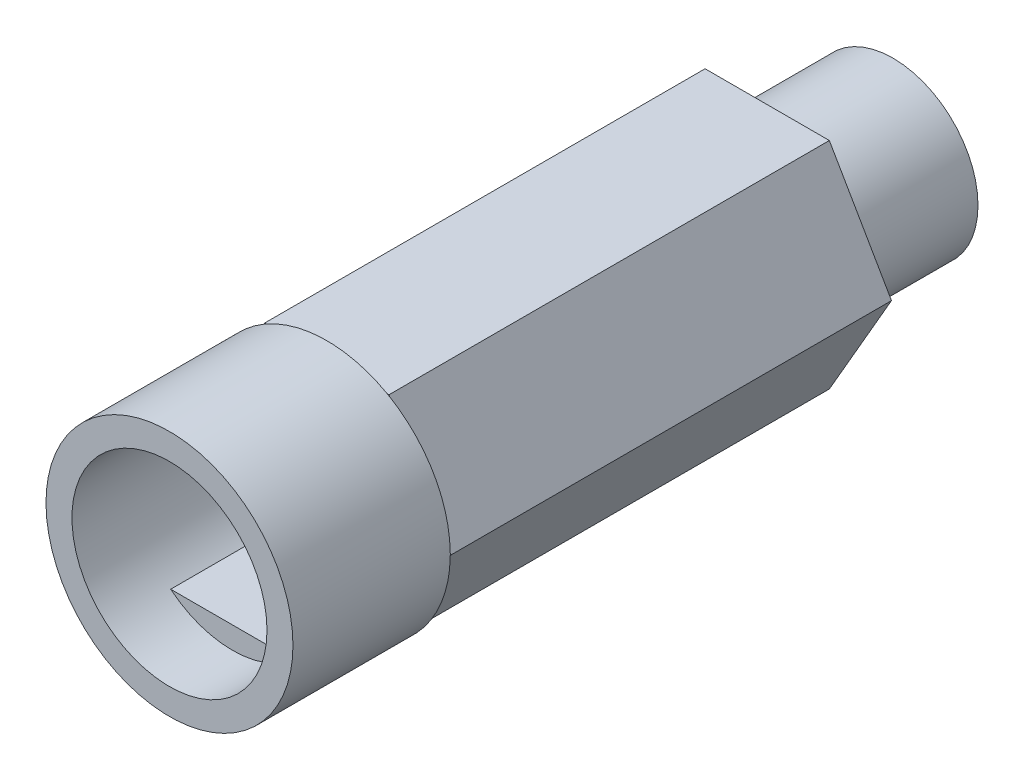
ISO-10303-21;
HEADER;
FILE_DESCRIPTION(('STEP AP214'),'2;1');
FILE_NAME('part.step','',(''),(''),'','','');
FILE_SCHEMA(('AUTOMOTIVE_DESIGN { 1 0 10303 214 1 1 1 1 }'));
ENDSEC;
DATA;
#1=APPLICATION_CONTEXT('core data for automotive mechanical design processes');
#2=APPLICATION_PROTOCOL_DEFINITION('international standard','automotive_design',2000,#1);
#3=PRODUCT_CONTEXT('',#1,'mechanical');
#4=PRODUCT('Part','Part','',(#3));
#5=PRODUCT_RELATED_PRODUCT_CATEGORY('part','',(#4));
#6=PRODUCT_DEFINITION_FORMATION('','',#4);
#7=PRODUCT_DEFINITION_CONTEXT('part definition',#1,'design');
#8=PRODUCT_DEFINITION('design','',#6,#7);
#9=PRODUCT_DEFINITION_SHAPE('','',#8);
#10=(LENGTH_UNIT() NAMED_UNIT(*) SI_UNIT(.MILLI.,.METRE.));
#11=(NAMED_UNIT(*) PLANE_ANGLE_UNIT() SI_UNIT($,.RADIAN.));
#12=(NAMED_UNIT(*) SI_UNIT($,.STERADIAN.) SOLID_ANGLE_UNIT());
#13=UNCERTAINTY_MEASURE_WITH_UNIT(LENGTH_MEASURE(1.E-05),#10,'distance_accuracy_value','');
#14=(GEOMETRIC_REPRESENTATION_CONTEXT(3) GLOBAL_UNCERTAINTY_ASSIGNED_CONTEXT((#13)) GLOBAL_UNIT_ASSIGNED_CONTEXT((#10,
#11,#12)) REPRESENTATION_CONTEXT('',''));
#15=CARTESIAN_POINT('',(0.,0.,0.));
#16=DIRECTION('',(0.,0.,1.));
#17=DIRECTION('',(1.,0.,0.));
#18=AXIS2_PLACEMENT_3D('',#15,#16,#17);
#19=CARTESIAN_POINT('',(0.,-2.4,3.));
#20=DIRECTION('',(0.,-1.,0.));
#21=DIRECTION('',(0.,0.,-1.));
#22=AXIS2_PLACEMENT_3D('',#19,#20,#21);
#23=PLANE('',#22);
#24=DIRECTION('',(-1.,0.,0.));
#25=VECTOR('',#24,1.);
#26=CARTESIAN_POINT('',(0.,-2.4,17.));
#27=LINE('',#26,#25);
#28=CARTESIAN_POINT('',(1.96214168703486,-2.4,17.));
#29=VERTEX_POINT('',#28);
#30=CARTESIAN_POINT('',(-1.96214168703486,-2.4,17.));
#31=VERTEX_POINT('',#30);
#32=EDGE_CURVE('E140',#29,#31,#27,.T.);
#33=ORIENTED_EDGE('',*,*,#32,.F.);
#34=DIRECTION('',(0.,0.,1.));
#35=VECTOR('',#34,1.);
#36=CARTESIAN_POINT('',(1.96214168703486,-2.4,3.));
#37=LINE('',#36,#35);
#38=CARTESIAN_POINT('',(1.96214168703486,-2.4,3.));
#39=VERTEX_POINT('',#38);
#40=EDGE_CURVE('E153',#39,#29,#37,.T.);
#41=ORIENTED_EDGE('',*,*,#40,.F.);
#42=DIRECTION('',(1.,0.,0.));
#43=VECTOR('',#42,1.);
#44=CARTESIAN_POINT('',(0.,-2.4,3.));
#45=LINE('',#44,#43);
#46=CARTESIAN_POINT('',(-1.96214168703486,-2.4,3.));
#47=VERTEX_POINT('',#46);
#48=EDGE_CURVE('E157',#47,#39,#45,.T.);
#49=ORIENTED_EDGE('',*,*,#48,.F.);
#50=DIRECTION('',(0.,0.,1.));
#51=VECTOR('',#50,1.);
#52=CARTESIAN_POINT('',(-1.96214168703486,-2.4,3.));
#53=LINE('',#52,#51);
#54=EDGE_CURVE('E151',#47,#31,#53,.T.);
#55=ORIENTED_EDGE('',*,*,#54,.T.);
#56=EDGE_LOOP('',(#33,#41,#49,#55));
#57=FACE_BOUND('',#56,.T.);
#58=ADVANCED_FACE('F38',(#57),#23,.F.);
#59=CARTESIAN_POINT('',(0.,0.,14.));
#60=DIRECTION('',(0.,0.,1.));
#61=DIRECTION('',(1.,0.,0.));
#62=AXIS2_PLACEMENT_3D('',#59,#60,#61);
#63=PLANE('',#62);
#64=CARTESIAN_POINT('',(0.,0.,14.));
#65=DIRECTION('',(0.,0.,1.));
#66=DIRECTION('',(1.,0.,0.));
#67=AXIS2_PLACEMENT_3D('',#64,#65,#66);
#68=CIRCLE('',#67,3.925);
#69=CARTESIAN_POINT('',(2.00024353730412,3.37707725577505,14.));
#70=VERTEX_POINT('',#69);
#71=CARTESIAN_POINT('',(1.92451292539177,3.42080034494853,14.));
#72=VERTEX_POINT('',#71);
#73=EDGE_CURVE('E48',#70,#72,#68,.T.);
#74=ORIENTED_EDGE('',*,*,#73,.F.);
#75=DIRECTION('',(-0.5,0.866025403784439,0.));
#76=VECTOR('',#75,1.);
#77=CARTESIAN_POINT('',(3.95,0.,14.));
#78=LINE('',#77,#76);
#79=CARTESIAN_POINT('',(1.975,3.42080034494853,14.));
#80=VERTEX_POINT('',#79);
#81=EDGE_CURVE('E186',#70,#80,#78,.T.);
#82=ORIENTED_EDGE('',*,*,#81,.T.);
#83=DIRECTION('',(-1.,0.,0.));
#84=VECTOR('',#83,1.);
#85=CARTESIAN_POINT('',(1.975,3.42080034494853,14.));
#86=LINE('',#85,#84);
#87=EDGE_CURVE('E194',#80,#72,#86,.T.);
#88=ORIENTED_EDGE('',*,*,#87,.T.);
#89=EDGE_LOOP('',(#74,#82,#88));
#90=FACE_BOUND('',#89,.T.);
#91=ADVANCED_FACE('F322',(#90),#63,.T.);
#92=CARTESIAN_POINT('',(-1.92451292539177,3.42080034494854,14.));
#93=VERTEX_POINT('',#92);
#94=CARTESIAN_POINT('',(-2.00024353730412,3.37707725577505,14.));
#95=VERTEX_POINT('',#94);
#96=EDGE_CURVE('E276',#93,#95,#68,.T.);
#97=ORIENTED_EDGE('',*,*,#96,.F.);
#98=CARTESIAN_POINT('',(-1.975,3.42080034494854,14.));
#99=VERTEX_POINT('',#98);
#100=EDGE_CURVE('E192',#93,#99,#86,.T.);
#101=ORIENTED_EDGE('',*,*,#100,.T.);
#102=DIRECTION('',(-0.5,-0.866025403784439,0.));
#103=VECTOR('',#102,1.);
#104=CARTESIAN_POINT('',(-1.975,3.42080034494854,14.));
#105=LINE('',#104,#103);
#106=EDGE_CURVE('E200',#99,#95,#105,.T.);
#107=ORIENTED_EDGE('',*,*,#106,.T.);
#108=EDGE_LOOP('',(#97,#101,#107));
#109=FACE_BOUND('',#108,.T.);
#110=ADVANCED_FACE('F329',(#109),#63,.T.);
#111=CARTESIAN_POINT('',(-3.92475646269589,0.0437230891734901,14.));
#112=VERTEX_POINT('',#111);
#113=CARTESIAN_POINT('',(-3.92475646269589,-0.0437230891734879,14.));
#114=VERTEX_POINT('',#113);
#115=EDGE_CURVE('E272',#112,#114,#68,.T.);
#116=ORIENTED_EDGE('',*,*,#115,.F.);
#117=CARTESIAN_POINT('',(-3.95,0.,14.));
#118=VERTEX_POINT('',#117);
#119=EDGE_CURVE('E198',#112,#118,#105,.T.);
#120=ORIENTED_EDGE('',*,*,#119,.T.);
#121=DIRECTION('',(0.5,-0.866025403784439,0.));
#122=VECTOR('',#121,1.);
#123=CARTESIAN_POINT('',(-3.95,0.,14.));
#124=LINE('',#123,#122);
#125=EDGE_CURVE('E206',#118,#114,#124,.T.);
#126=ORIENTED_EDGE('',*,*,#125,.T.);
#127=EDGE_LOOP('',(#116,#120,#126));
#128=FACE_BOUND('',#127,.T.);
#129=ADVANCED_FACE('F340',(#128),#63,.T.);
#130=CARTESIAN_POINT('',(-2.00024353730412,-3.37707725577505,14.));
#131=VERTEX_POINT('',#130);
#132=CARTESIAN_POINT('',(-1.92451292539177,-3.42080034494853,14.));
#133=VERTEX_POINT('',#132);
#134=EDGE_CURVE('E268',#131,#133,#68,.T.);
#135=ORIENTED_EDGE('',*,*,#134,.F.);
#136=CARTESIAN_POINT('',(-1.975,-3.42080034494853,14.));
#137=VERTEX_POINT('',#136);
#138=EDGE_CURVE('E204',#131,#137,#124,.T.);
#139=ORIENTED_EDGE('',*,*,#138,.T.);
#140=DIRECTION('',(1.,0.,0.));
#141=VECTOR('',#140,1.);
#142=CARTESIAN_POINT('',(-1.975,-3.42080034494853,14.));
#143=LINE('',#142,#141);
#144=EDGE_CURVE('E212',#137,#133,#143,.T.);
#145=ORIENTED_EDGE('',*,*,#144,.T.);
#146=EDGE_LOOP('',(#135,#139,#145));
#147=FACE_BOUND('',#146,.T.);
#148=ADVANCED_FACE('F351',(#147),#63,.T.);
#149=CARTESIAN_POINT('',(1.92451292539177,-3.42080034494854,14.));
#150=VERTEX_POINT('',#149);
#151=CARTESIAN_POINT('',(2.00024353730411,-3.37707725577505,14.));
#152=VERTEX_POINT('',#151);
#153=EDGE_CURVE('E63',#150,#152,#68,.T.);
#154=ORIENTED_EDGE('',*,*,#153,.F.);
#155=CARTESIAN_POINT('',(1.975,-3.42080034494854,14.));
#156=VERTEX_POINT('',#155);
#157=EDGE_CURVE('E210',#150,#156,#143,.T.);
#158=ORIENTED_EDGE('',*,*,#157,.T.);
#159=DIRECTION('',(0.5,0.866025403784439,0.));
#160=VECTOR('',#159,1.);
#161=CARTESIAN_POINT('',(1.975,-3.42080034494854,14.));
#162=LINE('',#161,#160);
#163=EDGE_CURVE('E183',#156,#152,#162,.T.);
#164=ORIENTED_EDGE('',*,*,#163,.T.);
#165=EDGE_LOOP('',(#154,#158,#164));
#166=FACE_BOUND('',#165,.T.);
#167=ADVANCED_FACE('F359',(#166),#63,.T.);
#168=CARTESIAN_POINT('',(1.975,-3.42080034494854,14.));
#169=DIRECTION('',(-0.866025403784439,0.5,0.));
#170=DIRECTION('',(-0.5,-0.866025403784439,0.));
#171=AXIS2_PLACEMENT_3D('',#168,#169,#170);
#172=PLANE('',#171);
#173=DIRECTION('',(0.5,0.866025403784439,0.));
#174=VECTOR('',#173,1.);
#175=CARTESIAN_POINT('',(1.975,-3.42080034494854,0.));
#176=LINE('',#175,#174);
#177=CARTESIAN_POINT('',(1.975,-3.42080034494854,0.));
#178=VERTEX_POINT('',#177);
#179=CARTESIAN_POINT('',(3.95,0.,0.));
#180=VERTEX_POINT('',#179);
#181=EDGE_CURVE('E176',#178,#180,#176,.T.);
#182=ORIENTED_EDGE('',*,*,#181,.T.);
#183=DIRECTION('',(0.,0.,-1.));
#184=VECTOR('',#183,1.);
#185=CARTESIAN_POINT('',(3.95,0.,14.));
#186=LINE('',#185,#184);
#187=CARTESIAN_POINT('',(3.95,0.,14.));
#188=VERTEX_POINT('',#187);
#189=EDGE_CURVE('E42',#188,#180,#186,.T.);
#190=ORIENTED_EDGE('',*,*,#189,.F.);
#191=CARTESIAN_POINT('',(3.92475646269589,-0.0437230891734857,14.));
#192=VERTEX_POINT('',#191);
#193=EDGE_CURVE('E188',#192,#188,#162,.T.);
#194=ORIENTED_EDGE('',*,*,#193,.F.);
#195=EDGE_CURVE('E187',#152,#192,#162,.T.);
#196=ORIENTED_EDGE('',*,*,#195,.F.);
#197=ORIENTED_EDGE('',*,*,#163,.F.);
#198=DIRECTION('',(0.,0.,-1.));
#199=VECTOR('',#198,1.);
#200=CARTESIAN_POINT('',(1.975,-3.42080034494854,14.));
#201=LINE('',#200,#199);
#202=EDGE_CURVE('E216',#156,#178,#201,.T.);
#203=ORIENTED_EDGE('',*,*,#202,.T.);
#204=EDGE_LOOP('',(#182,#190,#194,#196,#197,#203));
#205=FACE_BOUND('',#204,.T.);
#206=ADVANCED_FACE('F40',(#205),#172,.F.);
#207=CARTESIAN_POINT('',(3.95,0.,14.));
#208=DIRECTION('',(-0.866025403784439,-0.5,0.));
#209=DIRECTION('',(0.5,-0.866025403784439,0.));
#210=AXIS2_PLACEMENT_3D('',#207,#208,#209);
#211=PLANE('',#210);
#212=DIRECTION('',(-0.5,0.866025403784439,0.));
#213=VECTOR('',#212,1.);
#214=CARTESIAN_POINT('',(3.95,0.,0.));
#215=LINE('',#214,#213);
#216=CARTESIAN_POINT('',(1.975,3.42080034494853,0.));
#217=VERTEX_POINT('',#216);
#218=EDGE_CURVE('E221',#180,#217,#215,.T.);
#219=ORIENTED_EDGE('',*,*,#218,.T.);
#220=DIRECTION('',(0.,0.,-1.));
#221=VECTOR('',#220,1.);
#222=CARTESIAN_POINT('',(1.975,3.42080034494853,14.));
#223=LINE('',#222,#221);
#224=EDGE_CURVE('E250',#80,#217,#223,.T.);
#225=ORIENTED_EDGE('',*,*,#224,.F.);
#226=ORIENTED_EDGE('',*,*,#81,.F.);
#227=CARTESIAN_POINT('',(3.92475646269589,0.0437230891734861,14.));
#228=VERTEX_POINT('',#227);
#229=EDGE_CURVE('E193',#228,#70,#78,.T.);
#230=ORIENTED_EDGE('',*,*,#229,.F.);
#231=EDGE_CURVE('E189',#188,#228,#78,.T.);
#232=ORIENTED_EDGE('',*,*,#231,.F.);
#233=ORIENTED_EDGE('',*,*,#189,.T.);
#234=EDGE_LOOP('',(#219,#225,#226,#230,#232,#233));
#235=FACE_BOUND('',#234,.T.);
#236=ADVANCED_FACE('F308',(#235),#211,.F.);
#237=CARTESIAN_POINT('',(1.975,3.42080034494853,14.));
#238=DIRECTION('',(0.,-1.,0.));
#239=DIRECTION('',(1.,0.,0.));
#240=AXIS2_PLACEMENT_3D('',#237,#238,#239);
#241=PLANE('',#240);
#242=DIRECTION('',(-1.,0.,0.));
#243=VECTOR('',#242,1.);
#244=CARTESIAN_POINT('',(1.975,3.42080034494853,0.));
#245=LINE('',#244,#243);
#246=CARTESIAN_POINT('',(-1.975,3.42080034494854,0.));
#247=VERTEX_POINT('',#246);
#248=EDGE_CURVE('E224',#217,#247,#245,.T.);
#249=ORIENTED_EDGE('',*,*,#248,.T.);
#250=DIRECTION('',(0.,0.,-1.));
#251=VECTOR('',#250,1.);
#252=CARTESIAN_POINT('',(-1.975,3.42080034494854,14.));
#253=LINE('',#252,#251);
#254=EDGE_CURVE('E247',#99,#247,#253,.T.);
#255=ORIENTED_EDGE('',*,*,#254,.F.);
#256=ORIENTED_EDGE('',*,*,#100,.F.);
#257=EDGE_CURVE('E199',#72,#93,#86,.T.);
#258=ORIENTED_EDGE('',*,*,#257,.F.);
#259=ORIENTED_EDGE('',*,*,#87,.F.);
#260=ORIENTED_EDGE('',*,*,#224,.T.);
#261=EDGE_LOOP('',(#249,#255,#256,#258,#259,#260));
#262=FACE_BOUND('',#261,.T.);
#263=ADVANCED_FACE('F318',(#262),#241,.F.);
#264=CARTESIAN_POINT('',(-1.975,3.42080034494854,14.));
#265=DIRECTION('',(0.866025403784438,-0.5,0.));
#266=DIRECTION('',(0.5,0.866025403784439,0.));
#267=AXIS2_PLACEMENT_3D('',#264,#265,#266);
#268=PLANE('',#267);
#269=DIRECTION('',(-0.5,-0.866025403784439,0.));
#270=VECTOR('',#269,1.);
#271=CARTESIAN_POINT('',(-1.975,3.42080034494854,0.));
#272=LINE('',#271,#270);
#273=CARTESIAN_POINT('',(-3.95,0.,0.));
#274=VERTEX_POINT('',#273);
#275=EDGE_CURVE('E227',#247,#274,#272,.T.);
#276=ORIENTED_EDGE('',*,*,#275,.T.);
#277=DIRECTION('',(0.,0.,-1.));
#278=VECTOR('',#277,1.);
#279=CARTESIAN_POINT('',(-3.95,0.,14.));
#280=LINE('',#279,#278);
#281=EDGE_CURVE('E243',#118,#274,#280,.T.);
#282=ORIENTED_EDGE('',*,*,#281,.F.);
#283=ORIENTED_EDGE('',*,*,#119,.F.);
#284=EDGE_CURVE('E205',#95,#112,#105,.T.);
#285=ORIENTED_EDGE('',*,*,#284,.F.);
#286=ORIENTED_EDGE('',*,*,#106,.F.);
#287=ORIENTED_EDGE('',*,*,#254,.T.);
#288=EDGE_LOOP('',(#276,#282,#283,#285,#286,#287));
#289=FACE_BOUND('',#288,.T.);
#290=ADVANCED_FACE('F332',(#289),#268,.F.);
#291=CARTESIAN_POINT('',(-3.95,0.,14.));
#292=DIRECTION('',(0.866025403784439,0.5,0.));
#293=DIRECTION('',(-0.5,0.866025403784439,0.));
#294=AXIS2_PLACEMENT_3D('',#291,#292,#293);
#295=PLANE('',#294);
#296=DIRECTION('',(0.5,-0.866025403784439,0.));
#297=VECTOR('',#296,1.);
#298=CARTESIAN_POINT('',(-3.95,0.,0.));
#299=LINE('',#298,#297);
#300=CARTESIAN_POINT('',(-1.975,-3.42080034494853,0.));
#301=VERTEX_POINT('',#300);
#302=EDGE_CURVE('E230',#274,#301,#299,.T.);
#303=ORIENTED_EDGE('',*,*,#302,.T.);
#304=DIRECTION('',(0.,0.,-1.));
#305=VECTOR('',#304,1.);
#306=CARTESIAN_POINT('',(-1.975,-3.42080034494853,14.));
#307=LINE('',#306,#305);
#308=EDGE_CURVE('E239',#137,#301,#307,.T.);
#309=ORIENTED_EDGE('',*,*,#308,.F.);
#310=ORIENTED_EDGE('',*,*,#138,.F.);
#311=EDGE_CURVE('E211',#114,#131,#124,.T.);
#312=ORIENTED_EDGE('',*,*,#311,.F.);
#313=ORIENTED_EDGE('',*,*,#125,.F.);
#314=ORIENTED_EDGE('',*,*,#281,.T.);
#315=EDGE_LOOP('',(#303,#309,#310,#312,#313,#314));
#316=FACE_BOUND('',#315,.T.);
#317=ADVANCED_FACE('F343',(#316),#295,.F.);
#318=CARTESIAN_POINT('',(-1.975,-3.42080034494853,14.));
#319=DIRECTION('',(0.,1.,0.));
#320=DIRECTION('',(-1.,0.,0.));
#321=AXIS2_PLACEMENT_3D('',#318,#319,#320);
#322=PLANE('',#321);
#323=DIRECTION('',(1.,0.,0.));
#324=VECTOR('',#323,1.);
#325=CARTESIAN_POINT('',(-1.975,-3.42080034494853,0.));
#326=LINE('',#325,#324);
#327=EDGE_CURVE('E233',#301,#178,#326,.T.);
#328=ORIENTED_EDGE('',*,*,#327,.T.);
#329=ORIENTED_EDGE('',*,*,#202,.F.);
#330=ORIENTED_EDGE('',*,*,#157,.F.);
#331=EDGE_CURVE('E217',#133,#150,#143,.T.);
#332=ORIENTED_EDGE('',*,*,#331,.F.);
#333=ORIENTED_EDGE('',*,*,#144,.F.);
#334=ORIENTED_EDGE('',*,*,#308,.T.);
#335=EDGE_LOOP('',(#328,#329,#330,#332,#333,#334));
#336=FACE_BOUND('',#335,.T.);
#337=ADVANCED_FACE('F354',(#336),#322,.F.);
#338=EDGE_CURVE('E182',#192,#228,#68,.T.);
#339=ORIENTED_EDGE('',*,*,#338,.F.);
#340=ORIENTED_EDGE('',*,*,#193,.T.);
#341=ORIENTED_EDGE('',*,*,#231,.T.);
#342=EDGE_LOOP('',(#339,#340,#341));
#343=FACE_BOUND('',#342,.T.);
#344=ADVANCED_FACE('F306',(#343),#63,.T.);
#345=CARTESIAN_POINT('',(0.,0.,0.));
#346=DIRECTION('',(0.,0.,1.));
#347=DIRECTION('',(1.,0.,0.));
#348=AXIS2_PLACEMENT_3D('',#345,#346,#347);
#349=PLANE('',#348);
#350=CARTESIAN_POINT('',(0.,0.,0.));
#351=DIRECTION('',(0.,0.,-1.));
#352=DIRECTION('',(-1.,0.,0.));
#353=AXIS2_PLACEMENT_3D('',#350,#351,#352);
#354=CIRCLE('',#353,2.7);
#355=CARTESIAN_POINT('',(-2.7,0.,0.));
#356=VERTEX_POINT('',#355);
#357=EDGE_CURVE('E11',#356,#356,#354,.T.);
#358=ORIENTED_EDGE('',*,*,#357,.F.);
#359=EDGE_LOOP('',(#358));
#360=FACE_BOUND('',#359,.T.);
#361=ORIENTED_EDGE('',*,*,#181,.F.);
#362=ORIENTED_EDGE('',*,*,#327,.F.);
#363=ORIENTED_EDGE('',*,*,#302,.F.);
#364=ORIENTED_EDGE('',*,*,#275,.F.);
#365=ORIENTED_EDGE('',*,*,#248,.F.);
#366=ORIENTED_EDGE('',*,*,#218,.F.);
#367=EDGE_LOOP('',(#361,#362,#363,#364,#365,#366));
#368=FACE_BOUND('',#367,.T.);
#369=ADVANCED_FACE('F315',(#360,#368),#349,.F.);
#370=CARTESIAN_POINT('',(0.,0.,14.));
#371=DIRECTION('',(0.,0.,1.));
#372=DIRECTION('',(1.,0.,0.));
#373=AXIS2_PLACEMENT_3D('',#370,#371,#372);
#374=PLANE('',#373);
#375=EDGE_CURVE('E165',#152,#192,#68,.T.);
#376=ORIENTED_EDGE('',*,*,#375,.F.);
#377=ORIENTED_EDGE('',*,*,#195,.T.);
#378=EDGE_LOOP('',(#376,#377));
#379=FACE_BOUND('',#378,.T.);
#380=ADVANCED_FACE('F299',(#379),#374,.F.);
#381=EDGE_CURVE('E177',#228,#70,#68,.T.);
#382=ORIENTED_EDGE('',*,*,#381,.F.);
#383=ORIENTED_EDGE('',*,*,#229,.T.);
#384=EDGE_LOOP('',(#382,#383));
#385=FACE_BOUND('',#384,.T.);
#386=ADVANCED_FACE('F391',(#385),#374,.F.);
#387=EDGE_CURVE('E181',#72,#93,#68,.T.);
#388=ORIENTED_EDGE('',*,*,#387,.F.);
#389=ORIENTED_EDGE('',*,*,#257,.T.);
#390=EDGE_LOOP('',(#388,#389));
#391=FACE_BOUND('',#390,.T.);
#392=ADVANCED_FACE('F324',(#391),#374,.F.);
#393=EDGE_CURVE('E284',#95,#112,#68,.T.);
#394=ORIENTED_EDGE('',*,*,#393,.F.);
#395=ORIENTED_EDGE('',*,*,#284,.T.);
#396=EDGE_LOOP('',(#394,#395));
#397=FACE_BOUND('',#396,.T.);
#398=ADVANCED_FACE('F405',(#397),#374,.F.);
#399=EDGE_CURVE('E287',#114,#131,#68,.T.);
#400=ORIENTED_EDGE('',*,*,#399,.F.);
#401=ORIENTED_EDGE('',*,*,#311,.T.);
#402=EDGE_LOOP('',(#400,#401));
#403=FACE_BOUND('',#402,.T.);
#404=ADVANCED_FACE('F399',(#403),#374,.F.);
#405=EDGE_CURVE('E290',#133,#150,#68,.T.);
#406=ORIENTED_EDGE('',*,*,#405,.F.);
#407=ORIENTED_EDGE('',*,*,#331,.T.);
#408=EDGE_LOOP('',(#406,#407));
#409=FACE_BOUND('',#408,.T.);
#410=ADVANCED_FACE('F392',(#409),#374,.F.);
#411=CARTESIAN_POINT('',(0.,0.,19.));
#412=DIRECTION('',(0.,0.,-1.));
#413=DIRECTION('',(-1.,0.,0.));
#414=AXIS2_PLACEMENT_3D('',#411,#412,#413);
#415=CYLINDRICAL_SURFACE('',#414,3.925);
#416=CARTESIAN_POINT('',(0.,0.,19.));
#417=DIRECTION('',(0.,0.,1.));
#418=DIRECTION('',(1.,0.,0.));
#419=AXIS2_PLACEMENT_3D('',#416,#417,#418);
#420=CIRCLE('',#419,3.925);
#421=CARTESIAN_POINT('',(3.925,0.,19.));
#422=VERTEX_POINT('',#421);
#423=EDGE_CURVE('E172',#422,#422,#420,.T.);
#424=ORIENTED_EDGE('',*,*,#423,.F.);
#425=EDGE_LOOP('',(#424));
#426=FACE_BOUND('',#425,.T.);
#427=ORIENTED_EDGE('',*,*,#381,.T.);
#428=ORIENTED_EDGE('',*,*,#73,.T.);
#429=ORIENTED_EDGE('',*,*,#387,.T.);
#430=ORIENTED_EDGE('',*,*,#96,.T.);
#431=ORIENTED_EDGE('',*,*,#393,.T.);
#432=ORIENTED_EDGE('',*,*,#115,.T.);
#433=ORIENTED_EDGE('',*,*,#399,.T.);
#434=ORIENTED_EDGE('',*,*,#134,.T.);
#435=ORIENTED_EDGE('',*,*,#405,.T.);
#436=ORIENTED_EDGE('',*,*,#153,.T.);
#437=ORIENTED_EDGE('',*,*,#375,.T.);
#438=ORIENTED_EDGE('',*,*,#338,.T.);
#439=EDGE_LOOP('',(#427,#428,#429,#430,#431,#432,#433,#434,#435,#436,#437,#438));
#440=FACE_BOUND('',#439,.T.);
#441=ADVANCED_FACE('F296',(#426,#440),#415,.T.);
#442=CARTESIAN_POINT('',(0.,0.,19.));
#443=DIRECTION('',(0.,0.,1.));
#444=DIRECTION('',(1.,0.,0.));
#445=AXIS2_PLACEMENT_3D('',#442,#443,#444);
#446=PLANE('',#445);
#447=CARTESIAN_POINT('',(0.,0.,19.));
#448=DIRECTION('',(0.,0.,1.));
#449=DIRECTION('',(1.,0.,0.));
#450=AXIS2_PLACEMENT_3D('',#447,#448,#449);
#451=CIRCLE('',#450,3.1);
#452=CARTESIAN_POINT('',(3.1,0.,19.));
#453=VERTEX_POINT('',#452);
#454=EDGE_CURVE('E146',#453,#453,#451,.T.);
#455=ORIENTED_EDGE('',*,*,#454,.F.);
#456=EDGE_LOOP('',(#455));
#457=FACE_BOUND('',#456,.T.);
#458=ORIENTED_EDGE('',*,*,#423,.T.);
#459=EDGE_LOOP('',(#458));
#460=FACE_BOUND('',#459,.T.);
#461=ADVANCED_FACE('F386',(#457,#460),#446,.T.);
#462=CARTESIAN_POINT('',(0.,0.,-4.));
#463=DIRECTION('',(0.,0.,1.));
#464=DIRECTION('',(1.,0.,0.));
#465=AXIS2_PLACEMENT_3D('',#462,#463,#464);
#466=CYLINDRICAL_SURFACE('',#465,2.7);
#467=CARTESIAN_POINT('',(0.,0.,-4.));
#468=DIRECTION('',(0.,0.,-1.));
#469=DIRECTION('',(-1.,0.,0.));
#470=AXIS2_PLACEMENT_3D('',#467,#468,#469);
#471=CIRCLE('',#470,2.7);
#472=CARTESIAN_POINT('',(-2.7,0.,-4.));
#473=VERTEX_POINT('',#472);
#474=EDGE_CURVE('E160',#473,#473,#471,.T.);
#475=ORIENTED_EDGE('',*,*,#474,.F.);
#476=EDGE_LOOP('',(#475));
#477=FACE_BOUND('',#476,.T.);
#478=ORIENTED_EDGE('',*,*,#357,.T.);
#479=EDGE_LOOP('',(#478));
#480=FACE_BOUND('',#479,.T.);
#481=ADVANCED_FACE('F382',(#477,#480),#466,.T.);
#482=CARTESIAN_POINT('',(0.,0.,-4.));
#483=DIRECTION('',(0.,0.,-1.));
#484=DIRECTION('',(-1.,0.,0.));
#485=AXIS2_PLACEMENT_3D('',#482,#483,#484);
#486=PLANE('',#485);
#487=ORIENTED_EDGE('',*,*,#474,.T.);
#488=EDGE_LOOP('',(#487));
#489=FACE_BOUND('',#488,.T.);
#490=ADVANCED_FACE('F379',(#489),#486,.T.);
#491=CARTESIAN_POINT('',(0.,0.,3.));
#492=DIRECTION('',(0.,0.,1.));
#493=DIRECTION('',(1.,0.,0.));
#494=AXIS2_PLACEMENT_3D('',#491,#492,#493);
#495=CYLINDRICAL_SURFACE('',#494,3.1);
#496=ORIENTED_EDGE('',*,*,#454,.T.);
#497=EDGE_LOOP('',(#496));
#498=FACE_BOUND('',#497,.T.);
#499=ORIENTED_EDGE('',*,*,#40,.T.);
#500=CARTESIAN_POINT('',(0.,0.,17.));
#501=DIRECTION('',(0.,0.,1.));
#502=DIRECTION('',(1.,0.,0.));
#503=AXIS2_PLACEMENT_3D('',#500,#501,#502);
#504=CIRCLE('',#503,3.1);
#505=EDGE_CURVE('E55',#31,#29,#504,.T.);
#506=ORIENTED_EDGE('',*,*,#505,.F.);
#507=ORIENTED_EDGE('',*,*,#54,.F.);
#508=CARTESIAN_POINT('',(0.,0.,3.));
#509=DIRECTION('',(0.,0.,1.));
#510=DIRECTION('',(1.,0.,0.));
#511=AXIS2_PLACEMENT_3D('',#508,#509,#510);
#512=CIRCLE('',#511,3.1);
#513=EDGE_CURVE('E167',#39,#47,#512,.T.);
#514=ORIENTED_EDGE('',*,*,#513,.F.);
#515=EDGE_LOOP('',(#499,#506,#507,#514));
#516=FACE_BOUND('',#515,.T.);
#517=ADVANCED_FACE('F149',(#498,#516),#495,.F.);
#518=CARTESIAN_POINT('',(0.,0.,3.));
#519=DIRECTION('',(0.,0.,1.));
#520=DIRECTION('',(1.,0.,0.));
#521=AXIS2_PLACEMENT_3D('',#518,#519,#520);
#522=PLANE('',#521);
#523=ORIENTED_EDGE('',*,*,#48,.T.);
#524=ORIENTED_EDGE('',*,*,#513,.T.);
#525=EDGE_LOOP('',(#523,#524));
#526=FACE_BOUND('',#525,.T.);
#527=ADVANCED_FACE('F545',(#526),#522,.T.);
#528=CARTESIAN_POINT('',(0.,0.,17.));
#529=DIRECTION('',(0.,0.,1.));
#530=DIRECTION('',(1.,0.,0.));
#531=AXIS2_PLACEMENT_3D('',#528,#529,#530);
#532=PLANE('',#531);
#533=ORIENTED_EDGE('',*,*,#32,.T.);
#534=ORIENTED_EDGE('',*,*,#505,.T.);
#535=EDGE_LOOP('',(#533,#534));
#536=FACE_BOUND('',#535,.T.);
#537=ADVANCED_FACE('F141',(#536),#532,.T.);
#538=CLOSED_SHELL('',(#58,#91,#110,#129,#148,#167,#206,#236,#263,#290,#317,#337,#344,#369,#380,
#386,#392,#398,#404,#410,#441,#461,#481,#490,#517,#527,#537));
#539=MANIFOLD_SOLID_BREP('B2',#538);
#540=ADVANCED_BREP_SHAPE_REPRESENTATION('',(#18,#539),#14);
#541=SHAPE_DEFINITION_REPRESENTATION(#9,#540);
ENDSEC;
END-ISO-10303-21;
